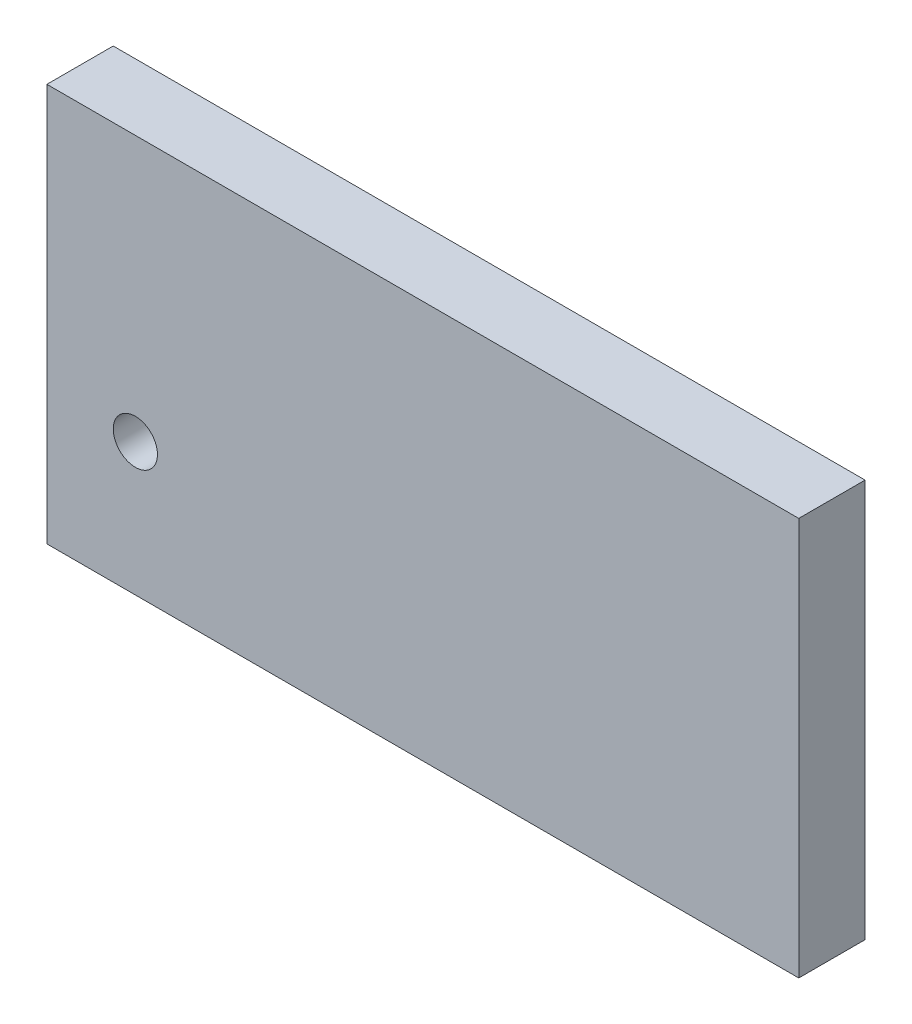
ISO-10303-21;
HEADER;
FILE_DESCRIPTION(('STEP AP214'),'2;1');
FILE_NAME('part.step','',(''),(''),'','','');
FILE_SCHEMA(('AUTOMOTIVE_DESIGN { 1 0 10303 214 1 1 1 1 }'));
ENDSEC;
DATA;
#1=APPLICATION_CONTEXT('core data for automotive mechanical design processes');
#2=APPLICATION_PROTOCOL_DEFINITION('international standard','automotive_design',2000,#1);
#3=PRODUCT_CONTEXT('',#1,'mechanical');
#4=PRODUCT('Part','Part','',(#3));
#5=PRODUCT_RELATED_PRODUCT_CATEGORY('part','',(#4));
#6=PRODUCT_DEFINITION_FORMATION('','',#4);
#7=PRODUCT_DEFINITION_CONTEXT('part definition',#1,'design');
#8=PRODUCT_DEFINITION('design','',#6,#7);
#9=PRODUCT_DEFINITION_SHAPE('','',#8);
#10=(LENGTH_UNIT() NAMED_UNIT(*) SI_UNIT(.MILLI.,.METRE.));
#11=(NAMED_UNIT(*) PLANE_ANGLE_UNIT() SI_UNIT($,.RADIAN.));
#12=(NAMED_UNIT(*) SI_UNIT($,.STERADIAN.) SOLID_ANGLE_UNIT());
#13=UNCERTAINTY_MEASURE_WITH_UNIT(LENGTH_MEASURE(1.E-05),#10,'distance_accuracy_value','');
#14=(GEOMETRIC_REPRESENTATION_CONTEXT(3) GLOBAL_UNCERTAINTY_ASSIGNED_CONTEXT((#13)) GLOBAL_UNIT_ASSIGNED_CONTEXT((#10,
#11,#12)) REPRESENTATION_CONTEXT('',''));
#15=CARTESIAN_POINT('',(0.,0.,0.));
#16=DIRECTION('',(0.,0.,1.));
#17=DIRECTION('',(1.,0.,0.));
#18=AXIS2_PLACEMENT_3D('',#15,#16,#17);
#19=CARTESIAN_POINT('',(0.,0.,19.05));
#20=DIRECTION('',(0.,0.,1.));
#21=DIRECTION('',(1.,0.,0.));
#22=AXIS2_PLACEMENT_3D('',#19,#20,#21);
#23=PLANE('',#22);
#24=DIRECTION('',(0.,-1.,0.));
#25=VECTOR('',#24,1.);
#26=CARTESIAN_POINT('',(251.836295427458,141.49467147037,19.05));
#27=LINE('',#26,#25);
#28=CARTESIAN_POINT('',(251.836295427458,141.49467147037,19.05));
#29=VERTEX_POINT('',#28);
#30=CARTESIAN_POINT('',(251.836295427458,27.1946714703701,19.05));
#31=VERTEX_POINT('',#30);
#32=EDGE_CURVE('E85',#29,#31,#27,.T.);
#33=ORIENTED_EDGE('',*,*,#32,.T.);
#34=DIRECTION('',(1.,0.,0.));
#35=VECTOR('',#34,1.);
#36=CARTESIAN_POINT('',(251.836295427458,27.1946714703701,19.05));
#37=LINE('',#36,#35);
#38=CARTESIAN_POINT('',(467.736295427459,27.1946714703701,19.05));
#39=VERTEX_POINT('',#38);
#40=EDGE_CURVE('E80',#31,#39,#37,.T.);
#41=ORIENTED_EDGE('',*,*,#40,.T.);
#42=DIRECTION('',(0.,1.,0.));
#43=VECTOR('',#42,1.);
#44=CARTESIAN_POINT('',(467.736295427459,141.49467147037,19.05));
#45=LINE('',#44,#43);
#46=CARTESIAN_POINT('',(467.736295427459,141.49467147037,19.05));
#47=VERTEX_POINT('',#46);
#48=EDGE_CURVE('E83',#39,#47,#45,.T.);
#49=ORIENTED_EDGE('',*,*,#48,.T.);
#50=DIRECTION('',(-1.,0.,0.));
#51=VECTOR('',#50,1.);
#52=CARTESIAN_POINT('',(251.836295427458,141.49467147037,19.05));
#53=LINE('',#52,#51);
#54=EDGE_CURVE('E50',#47,#29,#53,.T.);
#55=ORIENTED_EDGE('',*,*,#54,.T.);
#56=EDGE_LOOP('',(#33,#41,#49,#55));
#57=FACE_BOUND('',#56,.T.);
#58=CARTESIAN_POINT('',(277.236295427458,65.2946714703701,19.05));
#59=DIRECTION('',(0.,0.,1.));
#60=DIRECTION('',(1.,0.,0.));
#61=AXIS2_PLACEMENT_3D('',#58,#59,#60);
#62=CIRCLE('',#61,6.35);
#63=CARTESIAN_POINT('',(270.886295427458,65.2946714703701,19.05));
#64=VERTEX_POINT('',#63);
#65=EDGE_CURVE('E100',#64,#64,#62,.T.);
#66=ORIENTED_EDGE('',*,*,#65,.F.);
#67=EDGE_LOOP('',(#66));
#68=FACE_BOUND('',#67,.T.);
#69=ADVANCED_FACE('F33',(#57,#68),#23,.T.);
#70=CARTESIAN_POINT('',(0.,0.,0.));
#71=DIRECTION('',(0.,0.,1.));
#72=DIRECTION('',(1.,0.,0.));
#73=AXIS2_PLACEMENT_3D('',#70,#71,#72);
#74=PLANE('',#73);
#75=DIRECTION('',(0.,-1.,0.));
#76=VECTOR('',#75,1.);
#77=CARTESIAN_POINT('',(251.836295427458,141.49467147037,0.));
#78=LINE('',#77,#76);
#79=CARTESIAN_POINT('',(251.836295427458,141.49467147037,0.));
#80=VERTEX_POINT('',#79);
#81=CARTESIAN_POINT('',(251.836295427458,27.1946714703701,0.));
#82=VERTEX_POINT('',#81);
#83=EDGE_CURVE('E97',#80,#82,#78,.T.);
#84=ORIENTED_EDGE('',*,*,#83,.F.);
#85=DIRECTION('',(-1.,0.,0.));
#86=VECTOR('',#85,1.);
#87=CARTESIAN_POINT('',(251.836295427458,141.49467147037,0.));
#88=LINE('',#87,#86);
#89=CARTESIAN_POINT('',(467.736295427459,141.49467147037,0.));
#90=VERTEX_POINT('',#89);
#91=EDGE_CURVE('E73',#90,#80,#88,.T.);
#92=ORIENTED_EDGE('',*,*,#91,.F.);
#93=DIRECTION('',(0.,1.,0.));
#94=VECTOR('',#93,1.);
#95=CARTESIAN_POINT('',(467.736295427459,141.49467147037,0.));
#96=LINE('',#95,#94);
#97=CARTESIAN_POINT('',(467.736295427459,27.1946714703701,0.));
#98=VERTEX_POINT('',#97);
#99=EDGE_CURVE('E67',#98,#90,#96,.T.);
#100=ORIENTED_EDGE('',*,*,#99,.F.);
#101=DIRECTION('',(1.,0.,0.));
#102=VECTOR('',#101,1.);
#103=CARTESIAN_POINT('',(251.836295427458,27.1946714703701,0.));
#104=LINE('',#103,#102);
#105=EDGE_CURVE('E89',#82,#98,#104,.T.);
#106=ORIENTED_EDGE('',*,*,#105,.F.);
#107=EDGE_LOOP('',(#84,#92,#100,#106));
#108=FACE_BOUND('',#107,.T.);
#109=CARTESIAN_POINT('',(277.236295427458,65.2946714703701,0.));
#110=DIRECTION('',(0.,0.,1.));
#111=DIRECTION('',(1.,0.,0.));
#112=AXIS2_PLACEMENT_3D('',#109,#110,#111);
#113=CIRCLE('',#112,6.35);
#114=CARTESIAN_POINT('',(270.886295427458,65.2946714703701,0.));
#115=VERTEX_POINT('',#114);
#116=EDGE_CURVE('E112',#115,#115,#113,.T.);
#117=ORIENTED_EDGE('',*,*,#116,.T.);
#118=EDGE_LOOP('',(#117));
#119=FACE_BOUND('',#118,.T.);
#120=ADVANCED_FACE('F108',(#108,#119),#74,.F.);
#121=CARTESIAN_POINT('',(251.836295427458,141.49467147037,19.05));
#122=DIRECTION('',(1.,0.,0.));
#123=DIRECTION('',(0.,0.,-1.));
#124=AXIS2_PLACEMENT_3D('',#121,#122,#123);
#125=PLANE('',#124);
#126=ORIENTED_EDGE('',*,*,#83,.T.);
#127=DIRECTION('',(0.,0.,-1.));
#128=VECTOR('',#127,1.);
#129=CARTESIAN_POINT('',(251.836295427458,27.1946714703701,19.05));
#130=LINE('',#129,#128);
#131=EDGE_CURVE('E11',#31,#82,#130,.T.);
#132=ORIENTED_EDGE('',*,*,#131,.F.);
#133=ORIENTED_EDGE('',*,*,#32,.F.);
#134=DIRECTION('',(0.,0.,-1.));
#135=VECTOR('',#134,1.);
#136=CARTESIAN_POINT('',(251.836295427458,141.49467147037,19.05));
#137=LINE('',#136,#135);
#138=EDGE_CURVE('E93',#29,#80,#137,.T.);
#139=ORIENTED_EDGE('',*,*,#138,.T.);
#140=EDGE_LOOP('',(#126,#132,#133,#139));
#141=FACE_BOUND('',#140,.T.);
#142=ADVANCED_FACE('F35',(#141),#125,.F.);
#143=CARTESIAN_POINT('',(251.836295427458,27.1946714703701,19.05));
#144=DIRECTION('',(0.,1.,0.));
#145=DIRECTION('',(0.,0.,1.));
#146=AXIS2_PLACEMENT_3D('',#143,#144,#145);
#147=PLANE('',#146);
#148=ORIENTED_EDGE('',*,*,#105,.T.);
#149=DIRECTION('',(0.,0.,-1.));
#150=VECTOR('',#149,1.);
#151=CARTESIAN_POINT('',(467.736295427459,27.1946714703701,19.05));
#152=LINE('',#151,#150);
#153=EDGE_CURVE('E42',#39,#98,#152,.T.);
#154=ORIENTED_EDGE('',*,*,#153,.F.);
#155=ORIENTED_EDGE('',*,*,#40,.F.);
#156=ORIENTED_EDGE('',*,*,#131,.T.);
#157=EDGE_LOOP('',(#148,#154,#155,#156));
#158=FACE_BOUND('',#157,.T.);
#159=ADVANCED_FACE('F88',(#158),#147,.F.);
#160=CARTESIAN_POINT('',(467.736295427459,141.49467147037,19.05));
#161=DIRECTION('',(-1.,0.,0.));
#162=DIRECTION('',(0.,0.,1.));
#163=AXIS2_PLACEMENT_3D('',#160,#161,#162);
#164=PLANE('',#163);
#165=ORIENTED_EDGE('',*,*,#99,.T.);
#166=DIRECTION('',(0.,0.,-1.));
#167=VECTOR('',#166,1.);
#168=CARTESIAN_POINT('',(467.736295427459,141.49467147037,19.05));
#169=LINE('',#168,#167);
#170=EDGE_CURVE('E90',#47,#90,#169,.T.);
#171=ORIENTED_EDGE('',*,*,#170,.F.);
#172=ORIENTED_EDGE('',*,*,#48,.F.);
#173=ORIENTED_EDGE('',*,*,#153,.T.);
#174=EDGE_LOOP('',(#165,#171,#172,#173));
#175=FACE_BOUND('',#174,.T.);
#176=ADVANCED_FACE('F91',(#175),#164,.F.);
#177=CARTESIAN_POINT('',(251.836295427458,141.49467147037,19.05));
#178=DIRECTION('',(0.,-1.,0.));
#179=DIRECTION('',(0.,0.,-1.));
#180=AXIS2_PLACEMENT_3D('',#177,#178,#179);
#181=PLANE('',#180);
#182=ORIENTED_EDGE('',*,*,#91,.T.);
#183=ORIENTED_EDGE('',*,*,#138,.F.);
#184=ORIENTED_EDGE('',*,*,#54,.F.);
#185=ORIENTED_EDGE('',*,*,#170,.T.);
#186=EDGE_LOOP('',(#182,#183,#184,#185));
#187=FACE_BOUND('',#186,.T.);
#188=ADVANCED_FACE('F105',(#187),#181,.F.);
#189=CARTESIAN_POINT('',(277.236295427458,65.2946714703701,19.05));
#190=DIRECTION('',(0.,0.,-1.));
#191=DIRECTION('',(-1.,0.,0.));
#192=AXIS2_PLACEMENT_3D('',#189,#190,#191);
#193=CYLINDRICAL_SURFACE('',#192,6.35);
#194=CARTESIAN_POINT('',(270.886295427458,65.2946714703701,19.05));
#195=CARTESIAN_POINT('',(270.886295427458,65.2946714703701,18.8515625));
#196=CARTESIAN_POINT('',(270.886295427458,65.2946714703701,18.653125));
#197=CARTESIAN_POINT('',(270.886295427458,65.2946714703701,18.25625));
#198=CARTESIAN_POINT('',(270.886295427458,65.2946714703701,18.0578125));
#199=CARTESIAN_POINT('',(270.886295427458,65.2946714703701,17.6609375));
#200=CARTESIAN_POINT('',(270.886295427458,65.2946714703701,17.4625));
#201=CARTESIAN_POINT('',(270.886295427458,65.2946714703701,17.065625));
#202=CARTESIAN_POINT('',(270.886295427458,65.2946714703701,16.8671875));
#203=CARTESIAN_POINT('',(270.886295427458,65.2946714703701,16.4703125));
#204=CARTESIAN_POINT('',(270.886295427458,65.2946714703701,16.271875));
#205=CARTESIAN_POINT('',(270.886295427458,65.2946714703701,15.875));
#206=CARTESIAN_POINT('',(270.886295427458,65.2946714703701,15.6765625));
#207=CARTESIAN_POINT('',(270.886295427458,65.2946714703701,15.2796875));
#208=CARTESIAN_POINT('',(270.886295427458,65.2946714703701,15.08125));
#209=CARTESIAN_POINT('',(270.886295427458,65.2946714703701,14.684375));
#210=CARTESIAN_POINT('',(270.886295427458,65.2946714703701,14.4859375));
#211=CARTESIAN_POINT('',(270.886295427458,65.2946714703701,14.0890625));
#212=CARTESIAN_POINT('',(270.886295427458,65.2946714703701,13.890625));
#213=CARTESIAN_POINT('',(270.886295427458,65.2946714703701,13.49375));
#214=CARTESIAN_POINT('',(270.886295427458,65.2946714703701,13.2953125));
#215=CARTESIAN_POINT('',(270.886295427458,65.2946714703701,12.8984375));
#216=CARTESIAN_POINT('',(270.886295427458,65.2946714703701,12.7));
#217=CARTESIAN_POINT('',(270.886295427458,65.2946714703701,12.303125));
#218=CARTESIAN_POINT('',(270.886295427458,65.2946714703701,12.1046875));
#219=CARTESIAN_POINT('',(270.886295427458,65.2946714703701,11.7078125));
#220=CARTESIAN_POINT('',(270.886295427458,65.2946714703701,11.509375));
#221=CARTESIAN_POINT('',(270.886295427458,65.2946714703701,11.1125));
#222=CARTESIAN_POINT('',(270.886295427458,65.2946714703701,10.9140625));
#223=CARTESIAN_POINT('',(270.886295427458,65.2946714703701,10.5171875));
#224=CARTESIAN_POINT('',(270.886295427458,65.2946714703701,10.31875));
#225=CARTESIAN_POINT('',(270.886295427458,65.2946714703701,9.921875));
#226=CARTESIAN_POINT('',(270.886295427458,65.2946714703701,9.7234375));
#227=CARTESIAN_POINT('',(270.886295427458,65.2946714703701,9.3265625));
#228=CARTESIAN_POINT('',(270.886295427458,65.2946714703701,9.128125));
#229=CARTESIAN_POINT('',(270.886295427458,65.2946714703701,8.73125));
#230=CARTESIAN_POINT('',(270.886295427458,65.2946714703701,8.5328125));
#231=CARTESIAN_POINT('',(270.886295427458,65.2946714703701,8.1359375));
#232=CARTESIAN_POINT('',(270.886295427458,65.2946714703701,7.9375));
#233=CARTESIAN_POINT('',(270.886295427458,65.2946714703701,7.540625));
#234=CARTESIAN_POINT('',(270.886295427458,65.2946714703701,7.3421875));
#235=CARTESIAN_POINT('',(270.886295427458,65.2946714703701,6.9453125));
#236=CARTESIAN_POINT('',(270.886295427458,65.2946714703701,6.746875));
#237=CARTESIAN_POINT('',(270.886295427458,65.2946714703701,6.35));
#238=CARTESIAN_POINT('',(270.886295427458,65.2946714703701,6.1515625));
#239=CARTESIAN_POINT('',(270.886295427458,65.2946714703701,5.7546875));
#240=CARTESIAN_POINT('',(270.886295427458,65.2946714703701,5.55625));
#241=CARTESIAN_POINT('',(270.886295427458,65.2946714703701,5.159375));
#242=CARTESIAN_POINT('',(270.886295427458,65.2946714703701,4.9609375));
#243=CARTESIAN_POINT('',(270.886295427458,65.2946714703701,4.5640625));
#244=CARTESIAN_POINT('',(270.886295427458,65.2946714703701,4.365625));
#245=CARTESIAN_POINT('',(270.886295427458,65.2946714703701,3.96875));
#246=CARTESIAN_POINT('',(270.886295427458,65.2946714703701,3.7703125));
#247=CARTESIAN_POINT('',(270.886295427458,65.2946714703701,3.3734375));
#248=CARTESIAN_POINT('',(270.886295427458,65.2946714703701,3.175));
#249=CARTESIAN_POINT('',(270.886295427458,65.2946714703701,2.778125));
#250=CARTESIAN_POINT('',(270.886295427458,65.2946714703701,2.5796875));
#251=CARTESIAN_POINT('',(270.886295427458,65.2946714703701,2.1828125));
#252=CARTESIAN_POINT('',(270.886295427458,65.2946714703701,1.984375));
#253=CARTESIAN_POINT('',(270.886295427458,65.2946714703701,1.5875));
#254=CARTESIAN_POINT('',(270.886295427458,65.2946714703701,1.3890625));
#255=CARTESIAN_POINT('',(270.886295427458,65.2946714703701,0.992187500000001));
#256=CARTESIAN_POINT('',(270.886295427458,65.2946714703701,0.793750000000001));
#257=CARTESIAN_POINT('',(270.886295427458,65.2946714703701,0.396875));
#258=CARTESIAN_POINT('',(270.886295427458,65.2946714703701,0.1984375));
#259=CARTESIAN_POINT('',(270.886295427458,65.2946714703701,0.));
#260=B_SPLINE_CURVE_WITH_KNOTS('',3,(#194,#195,#196,#197,#198,#199,#200,#201,#202,#203,#204,
#205,#206,#207,#208,#209,#210,#211,#212,#213,#214,#215,#216,#217,#218,#219,#220,#221,#222,#223,
#224,#225,#226,#227,#228,#229,#230,#231,#232,#233,#234,#235,#236,#237,#238,#239,#240,#241,#242,
#243,#244,#245,#246,#247,#248,#249,#250,#251,#252,#253,#254,#255,#256,#257,#258,#259),
.UNSPECIFIED.,.F.,.F.,(4,2,2,2,2,2,2,2,2,2,2,2,2,2,2,2,2,2,2,2,2,2,2,2,2,2,2,2,2,2,2,2,4),(0.,
0.5953125,1.190625,1.7859375,2.38125,2.9765625,3.571875,4.1671875,4.7625,5.3578125,5.953125,
6.5484375,7.14375,7.7390625,8.334375,8.9296875,9.525,10.1203125,10.715625,11.3109375,11.90625,
12.5015625,13.096875,13.6921875,14.2875,14.8828125,15.478125,16.0734375,16.66875,17.2640625,
17.859375,18.4546875,19.05),.UNSPECIFIED.);
#261=EDGE_CURVE('BSEAM118',#64,#115,#260,.T.);
#262=ORIENTED_EDGE('',*,*,#65,.T.);
#263=ORIENTED_EDGE('',*,*,#116,.F.);
#264=ORIENTED_EDGE('',*,*,#261,.T.);
#265=ORIENTED_EDGE('',*,*,#261,.F.);
#266=EDGE_LOOP('',(#262,#264,#263,#265));
#267=FACE_BOUND('',#266,.T.);
#268=ADVANCED_FACE('F118',(#267),#193,.F.);
#269=CLOSED_SHELL('',(#69,#120,#142,#159,#176,#188,#268));
#270=MANIFOLD_SOLID_BREP('B2',#269);
#271=ADVANCED_BREP_SHAPE_REPRESENTATION('',(#18,#270),#14);
#272=SHAPE_DEFINITION_REPRESENTATION(#9,#271);
ENDSEC;
END-ISO-10303-21;
